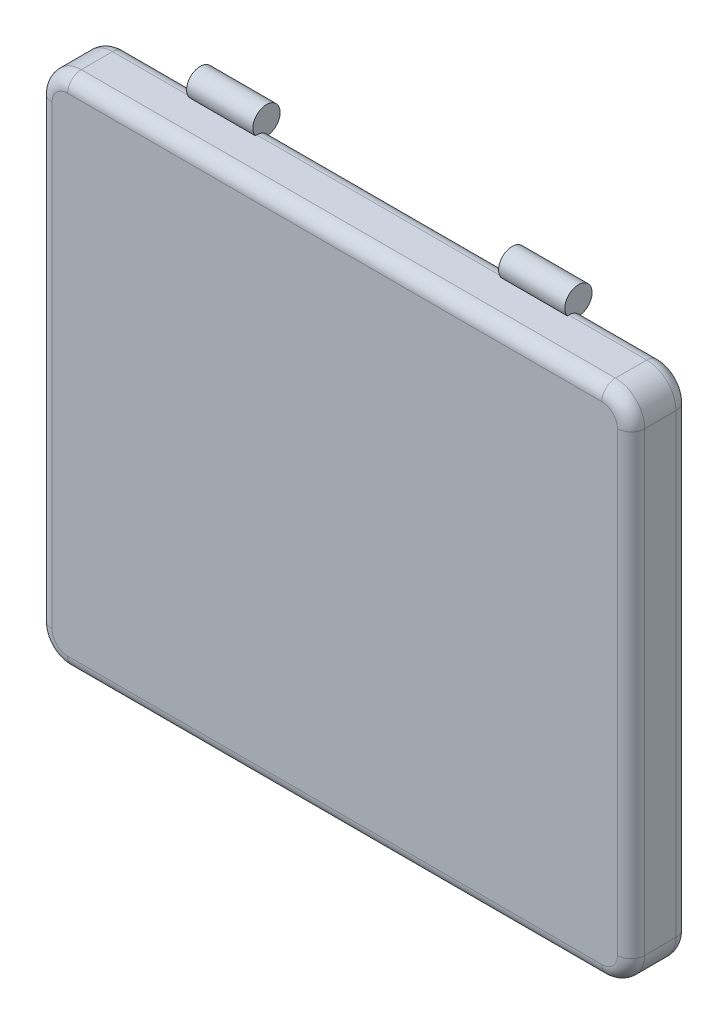
ISO-10303-21;
HEADER;
FILE_DESCRIPTION(('STEP AP214'),'2;1');
FILE_NAME('part.step','',(''),(''),'','','');
FILE_SCHEMA(('AUTOMOTIVE_DESIGN { 1 0 10303 214 1 1 1 1 }'));
ENDSEC;
DATA;
#1=APPLICATION_CONTEXT('core data for automotive mechanical design processes');
#2=APPLICATION_PROTOCOL_DEFINITION('international standard','automotive_design',2000,#1);
#3=PRODUCT_CONTEXT('',#1,'mechanical');
#4=PRODUCT('Part','Part','',(#3));
#5=PRODUCT_RELATED_PRODUCT_CATEGORY('part','',(#4));
#6=PRODUCT_DEFINITION_FORMATION('','',#4);
#7=PRODUCT_DEFINITION_CONTEXT('part definition',#1,'design');
#8=PRODUCT_DEFINITION('design','',#6,#7);
#9=PRODUCT_DEFINITION_SHAPE('','',#8);
#10=(LENGTH_UNIT() NAMED_UNIT(*) SI_UNIT(.MILLI.,.METRE.));
#11=(NAMED_UNIT(*) PLANE_ANGLE_UNIT() SI_UNIT($,.RADIAN.));
#12=(NAMED_UNIT(*) SI_UNIT($,.STERADIAN.) SOLID_ANGLE_UNIT());
#13=UNCERTAINTY_MEASURE_WITH_UNIT(LENGTH_MEASURE(1.E-05),#10,'distance_accuracy_value','');
#14=(GEOMETRIC_REPRESENTATION_CONTEXT(3) GLOBAL_UNCERTAINTY_ASSIGNED_CONTEXT((#13)) GLOBAL_UNIT_ASSIGNED_CONTEXT((#10,
#11,#12)) REPRESENTATION_CONTEXT('',''));
#15=CARTESIAN_POINT('',(0.,0.,0.));
#16=DIRECTION('',(0.,0.,1.));
#17=DIRECTION('',(1.,0.,0.));
#18=AXIS2_PLACEMENT_3D('',#15,#16,#17);
#19=CARTESIAN_POINT('',(358.,-117.,495.));
#20=DIRECTION('',(0.,0.,-1.));
#21=DIRECTION('',(-1.,0.,0.));
#22=AXIS2_PLACEMENT_3D('',#19,#20,#21);
#23=CYLINDRICAL_SURFACE('',#22,15.);
#24=DIRECTION('',(0.,0.,-1.));
#25=VECTOR('',#24,1.);
#26=CARTESIAN_POINT('',(358.,-132.,495.));
#27=LINE('',#26,#25);
#28=CARTESIAN_POINT('',(358.,-132.,488.));
#29=VERTEX_POINT('',#28);
#30=CARTESIAN_POINT('',(358.,-132.,472.));
#31=VERTEX_POINT('',#30);
#32=EDGE_CURVE('E242',#29,#31,#27,.T.);
#33=ORIENTED_EDGE('',*,*,#32,.F.);
#34=CARTESIAN_POINT('',(358.,-117.,488.));
#35=DIRECTION('',(0.,0.,1.));
#36=DIRECTION('',(1.,0.,0.));
#37=AXIS2_PLACEMENT_3D('',#34,#35,#36);
#38=CIRCLE('',#37,15.);
#39=CARTESIAN_POINT('',(343.,-117.,488.));
#40=VERTEX_POINT('',#39);
#41=EDGE_CURVE('E270',#29,#40,#38,.F.);
#42=ORIENTED_EDGE('',*,*,#41,.T.);
#43=DIRECTION('',(0.,0.,-1.));
#44=VECTOR('',#43,1.);
#45=CARTESIAN_POINT('',(343.,-117.,495.));
#46=LINE('',#45,#44);
#47=CARTESIAN_POINT('',(343.,-117.,472.));
#48=VERTEX_POINT('',#47);
#49=EDGE_CURVE('E224',#40,#48,#46,.T.);
#50=ORIENTED_EDGE('',*,*,#49,.T.);
#51=CARTESIAN_POINT('',(358.,-117.,472.));
#52=DIRECTION('',(0.,0.,1.));
#53=DIRECTION('',(1.,0.,0.));
#54=AXIS2_PLACEMENT_3D('',#51,#52,#53);
#55=CIRCLE('',#54,15.);
#56=EDGE_CURVE('E264',#48,#31,#55,.T.);
#57=ORIENTED_EDGE('',*,*,#56,.T.);
#58=EDGE_LOOP('',(#33,#42,#50,#57));
#59=FACE_BOUND('',#58,.T.);
#60=ADVANCED_FACE('F43',(#59),#23,.T.);
#61=CARTESIAN_POINT('',(358.,-132.,495.));
#62=DIRECTION('',(0.,1.,0.));
#63=DIRECTION('',(0.,0.,1.));
#64=AXIS2_PLACEMENT_3D('',#61,#62,#63);
#65=PLANE('',#64);
#66=ORIENTED_EDGE('',*,*,#32,.T.);
#67=DIRECTION('',(1.,0.,0.));
#68=VECTOR('',#67,1.);
#69=CARTESIAN_POINT('',(358.,-132.,472.));
#70=LINE('',#69,#68);
#71=CARTESIAN_POINT('',(632.,-132.,472.));
#72=VERTEX_POINT('',#71);
#73=EDGE_CURVE('E305',#31,#72,#70,.T.);
#74=ORIENTED_EDGE('',*,*,#73,.T.);
#75=DIRECTION('',(0.,0.,-1.));
#76=VECTOR('',#75,1.);
#77=CARTESIAN_POINT('',(632.,-132.,495.));
#78=LINE('',#77,#76);
#79=CARTESIAN_POINT('',(632.,-132.,488.));
#80=VERTEX_POINT('',#79);
#81=EDGE_CURVE('E245',#80,#72,#78,.T.);
#82=ORIENTED_EDGE('',*,*,#81,.F.);
#83=DIRECTION('',(1.,0.,0.));
#84=VECTOR('',#83,1.);
#85=CARTESIAN_POINT('',(358.,-132.,488.));
#86=LINE('',#85,#84);
#87=EDGE_CURVE('E297',#80,#29,#86,.F.);
#88=ORIENTED_EDGE('',*,*,#87,.T.);
#89=EDGE_LOOP('',(#66,#74,#82,#88));
#90=FACE_BOUND('',#89,.T.);
#91=ADVANCED_FACE('F400',(#90),#65,.F.);
#92=CARTESIAN_POINT('',(632.,-117.,495.));
#93=DIRECTION('',(0.,0.,-1.));
#94=DIRECTION('',(-1.,0.,0.));
#95=AXIS2_PLACEMENT_3D('',#92,#93,#94);
#96=CYLINDRICAL_SURFACE('',#95,15.0000000000001);
#97=DIRECTION('',(0.,0.,-1.));
#98=VECTOR('',#97,1.);
#99=CARTESIAN_POINT('',(647.,-117.,495.));
#100=LINE('',#99,#98);
#101=CARTESIAN_POINT('',(647.,-117.,488.));
#102=VERTEX_POINT('',#101);
#103=CARTESIAN_POINT('',(647.,-117.,472.));
#104=VERTEX_POINT('',#103);
#105=EDGE_CURVE('E239',#102,#104,#100,.T.);
#106=ORIENTED_EDGE('',*,*,#105,.F.);
#107=CARTESIAN_POINT('',(632.,-117.,488.));
#108=DIRECTION('',(0.,0.,1.));
#109=DIRECTION('',(1.,0.,0.));
#110=AXIS2_PLACEMENT_3D('',#107,#108,#109);
#111=CIRCLE('',#110,15.0000000000001);
#112=EDGE_CURVE('E283',#102,#80,#111,.F.);
#113=ORIENTED_EDGE('',*,*,#112,.T.);
#114=ORIENTED_EDGE('',*,*,#81,.T.);
#115=CARTESIAN_POINT('',(632.,-117.,472.));
#116=DIRECTION('',(0.,0.,1.));
#117=DIRECTION('',(1.,0.,0.));
#118=AXIS2_PLACEMENT_3D('',#115,#116,#117);
#119=CIRCLE('',#118,15.0000000000001);
#120=EDGE_CURVE('E276',#72,#104,#119,.T.);
#121=ORIENTED_EDGE('',*,*,#120,.T.);
#122=EDGE_LOOP('',(#106,#113,#114,#121));
#123=FACE_BOUND('',#122,.T.);
#124=ADVANCED_FACE('F404',(#123),#96,.T.);
#125=CARTESIAN_POINT('',(647.,-117.,495.));
#126=DIRECTION('',(-1.,0.,0.));
#127=DIRECTION('',(0.,0.,1.));
#128=AXIS2_PLACEMENT_3D('',#125,#126,#127);
#129=PLANE('',#128);
#130=DIRECTION('',(0.,0.,-1.));
#131=VECTOR('',#130,1.);
#132=CARTESIAN_POINT('',(647.,117.,495.));
#133=LINE('',#132,#131);
#134=CARTESIAN_POINT('',(647.,117.,488.));
#135=VERTEX_POINT('',#134);
#136=CARTESIAN_POINT('',(647.,117.,472.));
#137=VERTEX_POINT('',#136);
#138=EDGE_CURVE('E237',#135,#137,#133,.T.);
#139=ORIENTED_EDGE('',*,*,#138,.F.);
#140=DIRECTION('',(0.,1.,0.));
#141=VECTOR('',#140,1.);
#142=CARTESIAN_POINT('',(647.,-117.,488.));
#143=LINE('',#142,#141);
#144=EDGE_CURVE('E309',#135,#102,#143,.F.);
#145=ORIENTED_EDGE('',*,*,#144,.T.);
#146=ORIENTED_EDGE('',*,*,#105,.T.);
#147=DIRECTION('',(0.,1.,0.));
#148=VECTOR('',#147,1.);
#149=CARTESIAN_POINT('',(647.,-117.,472.));
#150=LINE('',#149,#148);
#151=EDGE_CURVE('E306',#104,#137,#150,.T.);
#152=ORIENTED_EDGE('',*,*,#151,.T.);
#153=EDGE_LOOP('',(#139,#145,#146,#152));
#154=FACE_BOUND('',#153,.T.);
#155=ADVANCED_FACE('F489',(#154),#129,.F.);
#156=CARTESIAN_POINT('',(632.,117.,495.));
#157=DIRECTION('',(0.,0.,-1.));
#158=DIRECTION('',(-1.,0.,0.));
#159=AXIS2_PLACEMENT_3D('',#156,#157,#158);
#160=CYLINDRICAL_SURFACE('',#159,15.0000000000001);
#161=DIRECTION('',(0.,0.,-1.));
#162=VECTOR('',#161,1.);
#163=CARTESIAN_POINT('',(632.,132.,495.));
#164=LINE('',#163,#162);
#165=CARTESIAN_POINT('',(632.,132.,488.));
#166=VERTEX_POINT('',#165);
#167=CARTESIAN_POINT('',(632.,132.,472.));
#168=VERTEX_POINT('',#167);
#169=EDGE_CURVE('E232',#166,#168,#164,.T.);
#170=ORIENTED_EDGE('',*,*,#169,.F.);
#171=CARTESIAN_POINT('',(632.,117.,488.));
#172=DIRECTION('',(0.,0.,1.));
#173=DIRECTION('',(1.,0.,0.));
#174=AXIS2_PLACEMENT_3D('',#171,#172,#173);
#175=CIRCLE('',#174,15.0000000000001);
#176=EDGE_CURVE('E280',#166,#135,#175,.F.);
#177=ORIENTED_EDGE('',*,*,#176,.T.);
#178=ORIENTED_EDGE('',*,*,#138,.T.);
#179=CARTESIAN_POINT('',(632.,117.,472.));
#180=DIRECTION('',(0.,0.,1.));
#181=DIRECTION('',(1.,0.,0.));
#182=AXIS2_PLACEMENT_3D('',#179,#180,#181);
#183=CIRCLE('',#182,15.0000000000001);
#184=EDGE_CURVE('E273',#137,#168,#183,.T.);
#185=ORIENTED_EDGE('',*,*,#184,.T.);
#186=EDGE_LOOP('',(#170,#177,#178,#185));
#187=FACE_BOUND('',#186,.T.);
#188=ADVANCED_FACE('F494',(#187),#160,.T.);
#189=CARTESIAN_POINT('',(632.,132.,495.));
#190=DIRECTION('',(0.,-1.,0.));
#191=DIRECTION('',(0.,0.,-1.));
#192=AXIS2_PLACEMENT_3D('',#189,#190,#191);
#193=PLANE('',#192);
#194=DIRECTION('',(-1.,0.,0.));
#195=VECTOR('',#194,1.);
#196=CARTESIAN_POINT('',(632.,132.,472.));
#197=LINE('',#196,#195);
#198=CARTESIAN_POINT('',(592.,132.,472.));
#199=VERTEX_POINT('',#198);
#200=EDGE_CURVE('E311',#168,#199,#197,.T.);
#201=ORIENTED_EDGE('',*,*,#200,.T.);
#202=DIRECTION('',(0.,0.,1.));
#203=VECTOR('',#202,1.);
#204=CARTESIAN_POINT('',(592.,132.,495.));
#205=LINE('',#204,#203);
#206=CARTESIAN_POINT('',(592.,132.,472.744562646538));
#207=VERTEX_POINT('',#206);
#208=EDGE_CURVE('E212',#199,#207,#205,.T.);
#209=ORIENTED_EDGE('',*,*,#208,.T.);
#210=DIRECTION('',(-1.,0.,0.));
#211=VECTOR('',#210,1.);
#212=CARTESIAN_POINT('',(592.,132.,472.744562646538));
#213=LINE('',#212,#211);
#214=CARTESIAN_POINT('',(558.,132.,472.744562646538));
#215=VERTEX_POINT('',#214);
#216=EDGE_CURVE('E219',#215,#207,#213,.F.);
#217=ORIENTED_EDGE('',*,*,#216,.F.);
#218=DIRECTION('',(0.,0.,1.));
#219=VECTOR('',#218,1.);
#220=CARTESIAN_POINT('',(558.,132.,495.));
#221=LINE('',#220,#219);
#222=CARTESIAN_POINT('',(558.,132.,472.));
#223=VERTEX_POINT('',#222);
#224=EDGE_CURVE('E215',#223,#215,#221,.T.);
#225=ORIENTED_EDGE('',*,*,#224,.F.);
#226=CARTESIAN_POINT('',(432.,132.,472.));
#227=VERTEX_POINT('',#226);
#228=EDGE_CURVE('E316',#223,#227,#197,.T.);
#229=ORIENTED_EDGE('',*,*,#228,.T.);
#230=DIRECTION('',(0.,0.,1.));
#231=VECTOR('',#230,1.);
#232=CARTESIAN_POINT('',(432.,132.,495.));
#233=LINE('',#232,#231);
#234=CARTESIAN_POINT('',(432.,132.,472.744562646538));
#235=VERTEX_POINT('',#234);
#236=EDGE_CURVE('E198',#227,#235,#233,.T.);
#237=ORIENTED_EDGE('',*,*,#236,.T.);
#238=DIRECTION('',(-1.,0.,0.));
#239=VECTOR('',#238,1.);
#240=CARTESIAN_POINT('',(432.,132.,472.744562646538));
#241=LINE('',#240,#239);
#242=CARTESIAN_POINT('',(398.,132.,472.744562646538));
#243=VERTEX_POINT('',#242);
#244=EDGE_CURVE('E205',#243,#235,#241,.F.);
#245=ORIENTED_EDGE('',*,*,#244,.F.);
#246=DIRECTION('',(0.,0.,1.));
#247=VECTOR('',#246,1.);
#248=CARTESIAN_POINT('',(398.,132.,495.));
#249=LINE('',#248,#247);
#250=CARTESIAN_POINT('',(398.,132.,472.));
#251=VERTEX_POINT('',#250);
#252=EDGE_CURVE('E189',#251,#243,#249,.T.);
#253=ORIENTED_EDGE('',*,*,#252,.F.);
#254=CARTESIAN_POINT('',(358.,132.,472.));
#255=VERTEX_POINT('',#254);
#256=EDGE_CURVE('E315',#251,#255,#197,.T.);
#257=ORIENTED_EDGE('',*,*,#256,.T.);
#258=DIRECTION('',(0.,0.,-1.));
#259=VECTOR('',#258,1.);
#260=CARTESIAN_POINT('',(358.,132.,495.));
#261=LINE('',#260,#259);
#262=CARTESIAN_POINT('',(358.,132.,488.));
#263=VERTEX_POINT('',#262);
#264=EDGE_CURVE('E227',#263,#255,#261,.T.);
#265=ORIENTED_EDGE('',*,*,#264,.F.);
#266=DIRECTION('',(-1.,0.,0.));
#267=VECTOR('',#266,1.);
#268=CARTESIAN_POINT('',(632.,132.,488.));
#269=LINE('',#268,#267);
#270=EDGE_CURVE('E312',#263,#166,#269,.F.);
#271=ORIENTED_EDGE('',*,*,#270,.T.);
#272=ORIENTED_EDGE('',*,*,#169,.T.);
#273=EDGE_LOOP('',(#201,#209,#217,#225,#229,#237,#245,#253,#257,#265,#271,#272));
#274=FACE_BOUND('',#273,.T.);
#275=ADVANCED_FACE('F209',(#274),#193,.F.);
#276=CARTESIAN_POINT('',(358.,117.,495.));
#277=DIRECTION('',(0.,0.,-1.));
#278=DIRECTION('',(-1.,0.,0.));
#279=AXIS2_PLACEMENT_3D('',#276,#277,#278);
#280=CYLINDRICAL_SURFACE('',#279,15.);
#281=DIRECTION('',(0.,0.,-1.));
#282=VECTOR('',#281,1.);
#283=CARTESIAN_POINT('',(343.,117.,495.));
#284=LINE('',#283,#282);
#285=CARTESIAN_POINT('',(343.,117.,488.));
#286=VERTEX_POINT('',#285);
#287=CARTESIAN_POINT('',(343.,117.,472.));
#288=VERTEX_POINT('',#287);
#289=EDGE_CURVE('E228',#286,#288,#284,.T.);
#290=ORIENTED_EDGE('',*,*,#289,.F.);
#291=CARTESIAN_POINT('',(358.,117.,488.));
#292=DIRECTION('',(0.,0.,1.));
#293=DIRECTION('',(1.,0.,0.));
#294=AXIS2_PLACEMENT_3D('',#291,#292,#293);
#295=CIRCLE('',#294,15.);
#296=EDGE_CURVE('E275',#286,#263,#295,.F.);
#297=ORIENTED_EDGE('',*,*,#296,.T.);
#298=ORIENTED_EDGE('',*,*,#264,.T.);
#299=CARTESIAN_POINT('',(358.,117.,472.));
#300=DIRECTION('',(0.,0.,1.));
#301=DIRECTION('',(1.,0.,0.));
#302=AXIS2_PLACEMENT_3D('',#299,#300,#301);
#303=CIRCLE('',#302,15.);
#304=EDGE_CURVE('E269',#255,#288,#303,.T.);
#305=ORIENTED_EDGE('',*,*,#304,.T.);
#306=EDGE_LOOP('',(#290,#297,#298,#305));
#307=FACE_BOUND('',#306,.T.);
#308=ADVANCED_FACE('F533',(#307),#280,.T.);
#309=CARTESIAN_POINT('',(343.,117.,495.));
#310=DIRECTION('',(1.,0.,0.));
#311=DIRECTION('',(0.,0.,-1.));
#312=AXIS2_PLACEMENT_3D('',#309,#310,#311);
#313=PLANE('',#312);
#314=ORIENTED_EDGE('',*,*,#289,.T.);
#315=DIRECTION('',(0.,-1.,0.));
#316=VECTOR('',#315,1.);
#317=CARTESIAN_POINT('',(343.,117.,472.));
#318=LINE('',#317,#316);
#319=EDGE_CURVE('E308',#288,#48,#318,.T.);
#320=ORIENTED_EDGE('',*,*,#319,.T.);
#321=ORIENTED_EDGE('',*,*,#49,.F.);
#322=DIRECTION('',(0.,-1.,0.));
#323=VECTOR('',#322,1.);
#324=CARTESIAN_POINT('',(343.,117.,488.));
#325=LINE('',#324,#323);
#326=EDGE_CURVE('E303',#40,#286,#325,.F.);
#327=ORIENTED_EDGE('',*,*,#326,.T.);
#328=EDGE_LOOP('',(#314,#320,#321,#327));
#329=FACE_BOUND('',#328,.T.);
#330=ADVANCED_FACE('F522',(#329),#313,.F.);
#331=CARTESIAN_POINT('',(358.,-117.,495.));
#332=DIRECTION('',(0.,0.,1.));
#333=DIRECTION('',(1.,0.,0.));
#334=AXIS2_PLACEMENT_3D('',#331,#332,#333);
#335=PLANE('',#334);
#336=CARTESIAN_POINT('',(632.,117.,495.));
#337=DIRECTION('',(0.,0.,1.));
#338=DIRECTION('',(1.,0.,0.));
#339=AXIS2_PLACEMENT_3D('',#336,#337,#338);
#340=CIRCLE('',#339,8.00000000000014);
#341=CARTESIAN_POINT('',(640.,117.,495.));
#342=VERTEX_POINT('',#341);
#343=CARTESIAN_POINT('',(632.,125.,495.));
#344=VERTEX_POINT('',#343);
#345=EDGE_CURVE('E259',#342,#344,#340,.T.);
#346=ORIENTED_EDGE('',*,*,#345,.T.);
#347=DIRECTION('',(-1.,0.,0.));
#348=VECTOR('',#347,1.);
#349=CARTESIAN_POINT('',(358.,125.,495.));
#350=LINE('',#349,#348);
#351=CARTESIAN_POINT('',(358.,125.,495.));
#352=VERTEX_POINT('',#351);
#353=EDGE_CURVE('E263',#344,#352,#350,.T.);
#354=ORIENTED_EDGE('',*,*,#353,.T.);
#355=CARTESIAN_POINT('',(358.,117.,495.));
#356=DIRECTION('',(0.,0.,1.));
#357=DIRECTION('',(1.,0.,0.));
#358=AXIS2_PLACEMENT_3D('',#355,#356,#357);
#359=CIRCLE('',#358,8.00000000000001);
#360=CARTESIAN_POINT('',(350.,117.,495.));
#361=VERTEX_POINT('',#360);
#362=EDGE_CURVE('E261',#352,#361,#359,.T.);
#363=ORIENTED_EDGE('',*,*,#362,.T.);
#364=DIRECTION('',(0.,-1.,0.));
#365=VECTOR('',#364,1.);
#366=CARTESIAN_POINT('',(350.,-117.,495.));
#367=LINE('',#366,#365);
#368=CARTESIAN_POINT('',(350.,-117.,495.));
#369=VERTEX_POINT('',#368);
#370=EDGE_CURVE('E254',#361,#369,#367,.T.);
#371=ORIENTED_EDGE('',*,*,#370,.T.);
#372=CARTESIAN_POINT('',(358.,-117.,495.));
#373=DIRECTION('',(0.,0.,1.));
#374=DIRECTION('',(1.,0.,0.));
#375=AXIS2_PLACEMENT_3D('',#372,#373,#374);
#376=CIRCLE('',#375,8.00000000000001);
#377=CARTESIAN_POINT('',(358.,-125.,495.));
#378=VERTEX_POINT('',#377);
#379=EDGE_CURVE('E252',#369,#378,#376,.T.);
#380=ORIENTED_EDGE('',*,*,#379,.T.);
#381=DIRECTION('',(1.,0.,0.));
#382=VECTOR('',#381,1.);
#383=CARTESIAN_POINT('',(632.,-125.,495.));
#384=LINE('',#383,#382);
#385=CARTESIAN_POINT('',(632.,-125.,495.));
#386=VERTEX_POINT('',#385);
#387=EDGE_CURVE('E247',#378,#386,#384,.T.);
#388=ORIENTED_EDGE('',*,*,#387,.T.);
#389=CARTESIAN_POINT('',(632.,-117.,495.));
#390=DIRECTION('',(0.,0.,1.));
#391=DIRECTION('',(1.,0.,0.));
#392=AXIS2_PLACEMENT_3D('',#389,#390,#391);
#393=CIRCLE('',#392,8.00000000000014);
#394=CARTESIAN_POINT('',(640.,-117.,495.));
#395=VERTEX_POINT('',#394);
#396=EDGE_CURVE('E249',#386,#395,#393,.T.);
#397=ORIENTED_EDGE('',*,*,#396,.T.);
#398=DIRECTION('',(0.,1.,0.));
#399=VECTOR('',#398,1.);
#400=CARTESIAN_POINT('',(640.,117.,495.));
#401=LINE('',#400,#399);
#402=EDGE_CURVE('E260',#395,#342,#401,.T.);
#403=ORIENTED_EDGE('',*,*,#402,.T.);
#404=EDGE_LOOP('',(#346,#354,#363,#371,#380,#388,#397,#403));
#405=FACE_BOUND('',#404,.T.);
#406=ADVANCED_FACE('F502',(#405),#335,.T.);
#407=CARTESIAN_POINT('',(358.,-117.,465.));
#408=DIRECTION('',(0.,0.,1.));
#409=DIRECTION('',(1.,0.,0.));
#410=AXIS2_PLACEMENT_3D('',#407,#408,#409);
#411=PLANE('',#410);
#412=CARTESIAN_POINT('',(632.,117.,465.));
#413=DIRECTION('',(0.,0.,1.));
#414=DIRECTION('',(1.,0.,0.));
#415=AXIS2_PLACEMENT_3D('',#412,#413,#414);
#416=CIRCLE('',#415,8.00000000000014);
#417=CARTESIAN_POINT('',(632.,125.,465.));
#418=VERTEX_POINT('',#417);
#419=CARTESIAN_POINT('',(640.,117.,465.));
#420=VERTEX_POINT('',#419);
#421=EDGE_CURVE('E293',#418,#420,#416,.F.);
#422=ORIENTED_EDGE('',*,*,#421,.T.);
#423=DIRECTION('',(0.,1.,0.));
#424=VECTOR('',#423,1.);
#425=CARTESIAN_POINT('',(640.,-117.,465.));
#426=LINE('',#425,#424);
#427=CARTESIAN_POINT('',(640.,-117.,465.));
#428=VERTEX_POINT('',#427);
#429=EDGE_CURVE('E296',#420,#428,#426,.F.);
#430=ORIENTED_EDGE('',*,*,#429,.T.);
#431=CARTESIAN_POINT('',(632.,-117.,465.));
#432=DIRECTION('',(0.,0.,1.));
#433=DIRECTION('',(1.,0.,0.));
#434=AXIS2_PLACEMENT_3D('',#431,#432,#433);
#435=CIRCLE('',#434,8.00000000000014);
#436=CARTESIAN_POINT('',(632.,-125.,465.));
#437=VERTEX_POINT('',#436);
#438=EDGE_CURVE('E291',#428,#437,#435,.F.);
#439=ORIENTED_EDGE('',*,*,#438,.T.);
#440=DIRECTION('',(1.,0.,0.));
#441=VECTOR('',#440,1.);
#442=CARTESIAN_POINT('',(358.,-125.,465.));
#443=LINE('',#442,#441);
#444=CARTESIAN_POINT('',(358.,-125.,465.));
#445=VERTEX_POINT('',#444);
#446=EDGE_CURVE('E292',#437,#445,#443,.F.);
#447=ORIENTED_EDGE('',*,*,#446,.T.);
#448=CARTESIAN_POINT('',(358.,-117.,465.));
#449=DIRECTION('',(0.,0.,1.));
#450=DIRECTION('',(1.,0.,0.));
#451=AXIS2_PLACEMENT_3D('',#448,#449,#450);
#452=CIRCLE('',#451,8.00000000000001);
#453=CARTESIAN_POINT('',(350.,-117.,465.));
#454=VERTEX_POINT('',#453);
#455=EDGE_CURVE('E288',#445,#454,#452,.F.);
#456=ORIENTED_EDGE('',*,*,#455,.T.);
#457=DIRECTION('',(0.,-1.,0.));
#458=VECTOR('',#457,1.);
#459=CARTESIAN_POINT('',(350.,-117.,465.));
#460=LINE('',#459,#458);
#461=CARTESIAN_POINT('',(350.,117.,465.));
#462=VERTEX_POINT('',#461);
#463=EDGE_CURVE('E290',#454,#462,#460,.F.);
#464=ORIENTED_EDGE('',*,*,#463,.T.);
#465=CARTESIAN_POINT('',(358.,117.,465.));
#466=DIRECTION('',(0.,0.,1.));
#467=DIRECTION('',(1.,0.,0.));
#468=AXIS2_PLACEMENT_3D('',#465,#466,#467);
#469=CIRCLE('',#468,8.00000000000001);
#470=CARTESIAN_POINT('',(358.,125.,465.));
#471=VERTEX_POINT('',#470);
#472=EDGE_CURVE('E282',#462,#471,#469,.F.);
#473=ORIENTED_EDGE('',*,*,#472,.T.);
#474=DIRECTION('',(-1.,0.,0.));
#475=VECTOR('',#474,1.);
#476=CARTESIAN_POINT('',(358.,125.,465.));
#477=LINE('',#476,#475);
#478=EDGE_CURVE('E281',#471,#418,#477,.F.);
#479=ORIENTED_EDGE('',*,*,#478,.T.);
#480=EDGE_LOOP('',(#422,#430,#439,#447,#456,#464,#473,#479));
#481=FACE_BOUND('',#480,.T.);
#482=ADVANCED_FACE('F442',(#481),#411,.F.);
#483=CARTESIAN_POINT('',(632.,117.,488.));
#484=DIRECTION('',(0.,0.,1.));
#485=DIRECTION('',(1.,0.,0.));
#486=AXIS2_PLACEMENT_3D('',#483,#484,#485);
#487=TOROIDAL_SURFACE('',#486,8.00000000000014,7.);
#488=CARTESIAN_POINT('',(640.,117.,488.));
#489=DIRECTION('',(0.,-1.,0.));
#490=DIRECTION('',(1.,0.,0.));
#491=AXIS2_PLACEMENT_3D('',#488,#489,#490);
#492=CIRCLE('',#491,7.);
#493=EDGE_CURVE('E333',#135,#342,#492,.T.);
#494=ORIENTED_EDGE('',*,*,#493,.F.);
#495=ORIENTED_EDGE('',*,*,#176,.F.);
#496=CARTESIAN_POINT('',(632.,125.,488.));
#497=DIRECTION('',(-1.,0.,0.));
#498=DIRECTION('',(0.,0.,1.));
#499=AXIS2_PLACEMENT_3D('',#496,#497,#498);
#500=CIRCLE('',#499,7.);
#501=EDGE_CURVE('E230',#344,#166,#500,.T.);
#502=ORIENTED_EDGE('',*,*,#501,.F.);
#503=ORIENTED_EDGE('',*,*,#345,.F.);
#504=EDGE_LOOP('',(#494,#495,#502,#503));
#505=FACE_BOUND('',#504,.T.);
#506=ADVANCED_FACE('F440',(#505),#487,.T.);
#507=CARTESIAN_POINT('',(358.,125.,488.));
#508=DIRECTION('',(1.,0.,0.));
#509=DIRECTION('',(0.,0.,-1.));
#510=AXIS2_PLACEMENT_3D('',#507,#508,#509);
#511=CYLINDRICAL_SURFACE('',#510,7.);
#512=ORIENTED_EDGE('',*,*,#501,.T.);
#513=ORIENTED_EDGE('',*,*,#270,.F.);
#514=CARTESIAN_POINT('',(358.,125.,488.));
#515=DIRECTION('',(-1.,0.,0.));
#516=DIRECTION('',(0.,0.,1.));
#517=AXIS2_PLACEMENT_3D('',#514,#515,#516);
#518=CIRCLE('',#517,7.);
#519=EDGE_CURVE('E335',#352,#263,#518,.T.);
#520=ORIENTED_EDGE('',*,*,#519,.F.);
#521=ORIENTED_EDGE('',*,*,#353,.F.);
#522=EDGE_LOOP('',(#512,#513,#520,#521));
#523=FACE_BOUND('',#522,.T.);
#524=ADVANCED_FACE('F433',(#523),#511,.T.);
#525=CARTESIAN_POINT('',(640.,-117.,488.));
#526=DIRECTION('',(0.,-1.,0.));
#527=DIRECTION('',(0.,0.,-1.));
#528=AXIS2_PLACEMENT_3D('',#525,#526,#527);
#529=CYLINDRICAL_SURFACE('',#528,7.);
#530=ORIENTED_EDGE('',*,*,#493,.T.);
#531=ORIENTED_EDGE('',*,*,#402,.F.);
#532=CARTESIAN_POINT('',(640.,-117.,488.));
#533=DIRECTION('',(0.,-1.,0.));
#534=DIRECTION('',(0.,0.,-1.));
#535=AXIS2_PLACEMENT_3D('',#532,#533,#534);
#536=CIRCLE('',#535,7.);
#537=EDGE_CURVE('E328',#102,#395,#536,.T.);
#538=ORIENTED_EDGE('',*,*,#537,.F.);
#539=ORIENTED_EDGE('',*,*,#144,.F.);
#540=EDGE_LOOP('',(#530,#531,#538,#539));
#541=FACE_BOUND('',#540,.T.);
#542=ADVANCED_FACE('F427',(#541),#529,.T.);
#543=CARTESIAN_POINT('',(358.,117.,488.));
#544=DIRECTION('',(0.,0.,1.));
#545=DIRECTION('',(1.,0.,0.));
#546=AXIS2_PLACEMENT_3D('',#543,#544,#545);
#547=TOROIDAL_SURFACE('',#546,8.00000000000001,7.);
#548=ORIENTED_EDGE('',*,*,#519,.T.);
#549=ORIENTED_EDGE('',*,*,#296,.F.);
#550=CARTESIAN_POINT('',(350.,117.,488.));
#551=DIRECTION('',(0.,-1.,0.));
#552=DIRECTION('',(0.,0.,-1.));
#553=AXIS2_PLACEMENT_3D('',#550,#551,#552);
#554=CIRCLE('',#553,7.);
#555=EDGE_CURVE('E326',#361,#286,#554,.T.);
#556=ORIENTED_EDGE('',*,*,#555,.F.);
#557=ORIENTED_EDGE('',*,*,#362,.F.);
#558=EDGE_LOOP('',(#548,#549,#556,#557));
#559=FACE_BOUND('',#558,.T.);
#560=ADVANCED_FACE('F422',(#559),#547,.T.);
#561=CARTESIAN_POINT('',(632.,-117.,488.));
#562=DIRECTION('',(0.,0.,1.));
#563=DIRECTION('',(1.,0.,0.));
#564=AXIS2_PLACEMENT_3D('',#561,#562,#563);
#565=TOROIDAL_SURFACE('',#564,8.00000000000014,7.);
#566=ORIENTED_EDGE('',*,*,#537,.T.);
#567=ORIENTED_EDGE('',*,*,#396,.F.);
#568=CARTESIAN_POINT('',(632.,-125.,488.));
#569=DIRECTION('',(-1.,0.,0.));
#570=DIRECTION('',(0.,0.,1.));
#571=AXIS2_PLACEMENT_3D('',#568,#569,#570);
#572=CIRCLE('',#571,7.);
#573=EDGE_CURVE('E323',#80,#386,#572,.T.);
#574=ORIENTED_EDGE('',*,*,#573,.F.);
#575=ORIENTED_EDGE('',*,*,#112,.F.);
#576=EDGE_LOOP('',(#566,#567,#574,#575));
#577=FACE_BOUND('',#576,.T.);
#578=ADVANCED_FACE('F423',(#577),#565,.T.);
#579=CARTESIAN_POINT('',(350.,-117.,488.));
#580=DIRECTION('',(0.,1.,0.));
#581=DIRECTION('',(0.,0.,1.));
#582=AXIS2_PLACEMENT_3D('',#579,#580,#581);
#583=CYLINDRICAL_SURFACE('',#582,7.);
#584=ORIENTED_EDGE('',*,*,#555,.T.);
#585=ORIENTED_EDGE('',*,*,#326,.F.);
#586=CARTESIAN_POINT('',(350.,-117.,488.));
#587=DIRECTION('',(0.,-1.,0.));
#588=DIRECTION('',(0.,0.,-1.));
#589=AXIS2_PLACEMENT_3D('',#586,#587,#588);
#590=CIRCLE('',#589,7.);
#591=EDGE_CURVE('E319',#369,#40,#590,.T.);
#592=ORIENTED_EDGE('',*,*,#591,.F.);
#593=ORIENTED_EDGE('',*,*,#370,.F.);
#594=EDGE_LOOP('',(#584,#585,#592,#593));
#595=FACE_BOUND('',#594,.T.);
#596=ADVANCED_FACE('F417',(#595),#583,.T.);
#597=CARTESIAN_POINT('',(358.,-125.,488.));
#598=DIRECTION('',(-1.,0.,0.));
#599=DIRECTION('',(0.,0.,1.));
#600=AXIS2_PLACEMENT_3D('',#597,#598,#599);
#601=CYLINDRICAL_SURFACE('',#600,7.);
#602=ORIENTED_EDGE('',*,*,#573,.T.);
#603=ORIENTED_EDGE('',*,*,#387,.F.);
#604=CARTESIAN_POINT('',(358.,-125.,488.));
#605=DIRECTION('',(-1.,0.,0.));
#606=DIRECTION('',(0.,0.,1.));
#607=AXIS2_PLACEMENT_3D('',#604,#605,#606);
#608=CIRCLE('',#607,7.);
#609=EDGE_CURVE('E318',#29,#378,#608,.T.);
#610=ORIENTED_EDGE('',*,*,#609,.F.);
#611=ORIENTED_EDGE('',*,*,#87,.F.);
#612=EDGE_LOOP('',(#602,#603,#610,#611));
#613=FACE_BOUND('',#612,.T.);
#614=ADVANCED_FACE('F412',(#613),#601,.T.);
#615=CARTESIAN_POINT('',(358.,-117.,488.));
#616=DIRECTION('',(0.,0.,1.));
#617=DIRECTION('',(1.,0.,0.));
#618=AXIS2_PLACEMENT_3D('',#615,#616,#617);
#619=TOROIDAL_SURFACE('',#618,8.00000000000001,7.);
#620=ORIENTED_EDGE('',*,*,#591,.T.);
#621=ORIENTED_EDGE('',*,*,#41,.F.);
#622=ORIENTED_EDGE('',*,*,#609,.T.);
#623=ORIENTED_EDGE('',*,*,#379,.F.);
#624=EDGE_LOOP('',(#620,#621,#622,#623));
#625=FACE_BOUND('',#624,.T.);
#626=ADVANCED_FACE('F407',(#625),#619,.T.);
#627=CARTESIAN_POINT('',(358.,-117.,472.));
#628=DIRECTION('',(0.,0.,1.));
#629=DIRECTION('',(1.,0.,0.));
#630=AXIS2_PLACEMENT_3D('',#627,#628,#629);
#631=TOROIDAL_SURFACE('',#630,8.00000000000001,7.);
#632=CARTESIAN_POINT('',(350.,-117.,472.));
#633=DIRECTION('',(0.,1.,0.));
#634=DIRECTION('',(0.,0.,1.));
#635=AXIS2_PLACEMENT_3D('',#632,#633,#634);
#636=CIRCLE('',#635,7.);
#637=EDGE_CURVE('E352',#454,#48,#636,.T.);
#638=ORIENTED_EDGE('',*,*,#637,.F.);
#639=ORIENTED_EDGE('',*,*,#455,.F.);
#640=CARTESIAN_POINT('',(358.,-125.,472.));
#641=DIRECTION('',(1.,0.,0.));
#642=DIRECTION('',(0.,0.,-1.));
#643=AXIS2_PLACEMENT_3D('',#640,#641,#642);
#644=CIRCLE('',#643,7.);
#645=EDGE_CURVE('E321',#31,#445,#644,.T.);
#646=ORIENTED_EDGE('',*,*,#645,.F.);
#647=ORIENTED_EDGE('',*,*,#56,.F.);
#648=EDGE_LOOP('',(#638,#639,#646,#647));
#649=FACE_BOUND('',#648,.T.);
#650=ADVANCED_FACE('F44',(#649),#631,.T.);
#651=CARTESIAN_POINT('',(358.,-125.,472.));
#652=DIRECTION('',(1.,0.,0.));
#653=DIRECTION('',(0.,0.,-1.));
#654=AXIS2_PLACEMENT_3D('',#651,#652,#653);
#655=CYLINDRICAL_SURFACE('',#654,7.);
#656=ORIENTED_EDGE('',*,*,#645,.T.);
#657=ORIENTED_EDGE('',*,*,#446,.F.);
#658=CARTESIAN_POINT('',(632.,-125.,472.));
#659=DIRECTION('',(1.,0.,0.));
#660=DIRECTION('',(0.,0.,-1.));
#661=AXIS2_PLACEMENT_3D('',#658,#659,#660);
#662=CIRCLE('',#661,7.);
#663=EDGE_CURVE('E355',#72,#437,#662,.T.);
#664=ORIENTED_EDGE('',*,*,#663,.F.);
#665=ORIENTED_EDGE('',*,*,#73,.F.);
#666=EDGE_LOOP('',(#656,#657,#664,#665));
#667=FACE_BOUND('',#666,.T.);
#668=ADVANCED_FACE('F461',(#667),#655,.T.);
#669=CARTESIAN_POINT('',(350.,117.,472.));
#670=DIRECTION('',(0.,-1.,0.));
#671=DIRECTION('',(0.,0.,-1.));
#672=AXIS2_PLACEMENT_3D('',#669,#670,#671);
#673=CYLINDRICAL_SURFACE('',#672,7.);
#674=ORIENTED_EDGE('',*,*,#637,.T.);
#675=ORIENTED_EDGE('',*,*,#319,.F.);
#676=CARTESIAN_POINT('',(350.,117.,472.));
#677=DIRECTION('',(0.,1.,0.));
#678=DIRECTION('',(0.,0.,1.));
#679=AXIS2_PLACEMENT_3D('',#676,#677,#678);
#680=CIRCLE('',#679,7.);
#681=EDGE_CURVE('E349',#462,#288,#680,.T.);
#682=ORIENTED_EDGE('',*,*,#681,.F.);
#683=ORIENTED_EDGE('',*,*,#463,.F.);
#684=EDGE_LOOP('',(#674,#675,#682,#683));
#685=FACE_BOUND('',#684,.T.);
#686=ADVANCED_FACE('F458',(#685),#673,.T.);
#687=CARTESIAN_POINT('',(632.,-117.,472.));
#688=DIRECTION('',(0.,0.,1.));
#689=DIRECTION('',(1.,0.,0.));
#690=AXIS2_PLACEMENT_3D('',#687,#688,#689);
#691=TOROIDAL_SURFACE('',#690,8.00000000000014,7.);
#692=ORIENTED_EDGE('',*,*,#663,.T.);
#693=ORIENTED_EDGE('',*,*,#438,.F.);
#694=CARTESIAN_POINT('',(640.,-117.,472.));
#695=DIRECTION('',(0.,1.,0.));
#696=DIRECTION('',(0.,0.,1.));
#697=AXIS2_PLACEMENT_3D('',#694,#695,#696);
#698=CIRCLE('',#697,7.);
#699=EDGE_CURVE('E347',#104,#428,#698,.T.);
#700=ORIENTED_EDGE('',*,*,#699,.F.);
#701=ORIENTED_EDGE('',*,*,#120,.F.);
#702=EDGE_LOOP('',(#692,#693,#700,#701));
#703=FACE_BOUND('',#702,.T.);
#704=ADVANCED_FACE('F457',(#703),#691,.T.);
#705=CARTESIAN_POINT('',(358.,117.,472.));
#706=DIRECTION('',(0.,0.,1.));
#707=DIRECTION('',(1.,0.,0.));
#708=AXIS2_PLACEMENT_3D('',#705,#706,#707);
#709=TOROIDAL_SURFACE('',#708,8.00000000000001,7.);
#710=ORIENTED_EDGE('',*,*,#681,.T.);
#711=ORIENTED_EDGE('',*,*,#304,.F.);
#712=CARTESIAN_POINT('',(358.,125.,472.));
#713=DIRECTION('',(1.,0.,0.));
#714=DIRECTION('',(0.,0.,-1.));
#715=AXIS2_PLACEMENT_3D('',#712,#713,#714);
#716=CIRCLE('',#715,7.);
#717=EDGE_CURVE('E342',#471,#255,#716,.T.);
#718=ORIENTED_EDGE('',*,*,#717,.F.);
#719=ORIENTED_EDGE('',*,*,#472,.F.);
#720=EDGE_LOOP('',(#710,#711,#718,#719));
#721=FACE_BOUND('',#720,.T.);
#722=ADVANCED_FACE('F455',(#721),#709,.T.);
#723=CARTESIAN_POINT('',(640.,-117.,472.));
#724=DIRECTION('',(0.,1.,0.));
#725=DIRECTION('',(0.,0.,1.));
#726=AXIS2_PLACEMENT_3D('',#723,#724,#725);
#727=CYLINDRICAL_SURFACE('',#726,7.);
#728=ORIENTED_EDGE('',*,*,#699,.T.);
#729=ORIENTED_EDGE('',*,*,#429,.F.);
#730=CARTESIAN_POINT('',(640.,117.,472.));
#731=DIRECTION('',(0.,1.,0.));
#732=DIRECTION('',(0.,0.,1.));
#733=AXIS2_PLACEMENT_3D('',#730,#731,#732);
#734=CIRCLE('',#733,7.);
#735=EDGE_CURVE('E341',#137,#420,#734,.T.);
#736=ORIENTED_EDGE('',*,*,#735,.F.);
#737=ORIENTED_EDGE('',*,*,#151,.F.);
#738=EDGE_LOOP('',(#728,#729,#736,#737));
#739=FACE_BOUND('',#738,.T.);
#740=ADVANCED_FACE('F449',(#739),#727,.T.);
#741=CARTESIAN_POINT('',(632.,125.,472.));
#742=DIRECTION('',(-1.,0.,0.));
#743=DIRECTION('',(0.,0.,1.));
#744=AXIS2_PLACEMENT_3D('',#741,#742,#743);
#745=CYLINDRICAL_SURFACE('',#744,7.);
#746=CARTESIAN_POINT('',(592.,125.,472.));
#747=DIRECTION('',(1.,0.,0.));
#748=DIRECTION('',(0.,0.,-1.));
#749=AXIS2_PLACEMENT_3D('',#746,#747,#748);
#750=CIRCLE('',#749,7.);
#751=CARTESIAN_POINT('',(592.,129.036985660048,466.281368452106));
#752=VERTEX_POINT('',#751);
#753=EDGE_CURVE('E11',#199,#752,#750,.F.);
#754=ORIENTED_EDGE('',*,*,#753,.F.);
#755=ORIENTED_EDGE('',*,*,#200,.F.);
#756=CARTESIAN_POINT('',(632.,125.,472.));
#757=DIRECTION('',(1.,0.,0.));
#758=DIRECTION('',(0.,0.,-1.));
#759=AXIS2_PLACEMENT_3D('',#756,#757,#758);
#760=CIRCLE('',#759,7.);
#761=EDGE_CURVE('E225',#418,#168,#760,.T.);
#762=ORIENTED_EDGE('',*,*,#761,.F.);
#763=ORIENTED_EDGE('',*,*,#478,.F.);
#764=ORIENTED_EDGE('',*,*,#717,.T.);
#765=ORIENTED_EDGE('',*,*,#256,.F.);
#766=CARTESIAN_POINT('',(398.,125.,472.));
#767=DIRECTION('',(1.,0.,0.));
#768=DIRECTION('',(0.,0.,-1.));
#769=AXIS2_PLACEMENT_3D('',#766,#767,#768);
#770=CIRCLE('',#769,7.);
#771=CARTESIAN_POINT('',(398.,129.036985660048,466.281368452106));
#772=VERTEX_POINT('',#771);
#773=EDGE_CURVE('E195',#251,#772,#770,.F.);
#774=ORIENTED_EDGE('',*,*,#773,.T.);
#775=DIRECTION('',(-1.,0.,0.));
#776=VECTOR('',#775,1.);
#777=CARTESIAN_POINT('',(415.,129.036985660048,466.281368452106));
#778=LINE('',#777,#776);
#779=CARTESIAN_POINT('',(432.,129.036985660048,466.281368452106));
#780=VERTEX_POINT('',#779);
#781=EDGE_CURVE('E202',#772,#780,#778,.F.);
#782=ORIENTED_EDGE('',*,*,#781,.T.);
#783=CARTESIAN_POINT('',(432.,125.,472.));
#784=DIRECTION('',(1.,0.,0.));
#785=DIRECTION('',(0.,0.,-1.));
#786=AXIS2_PLACEMENT_3D('',#783,#784,#785);
#787=CIRCLE('',#786,7.);
#788=EDGE_CURVE('E362',#227,#780,#787,.F.);
#789=ORIENTED_EDGE('',*,*,#788,.F.);
#790=ORIENTED_EDGE('',*,*,#228,.F.);
#791=CARTESIAN_POINT('',(558.,125.,472.));
#792=DIRECTION('',(1.,0.,0.));
#793=DIRECTION('',(0.,0.,-1.));
#794=AXIS2_PLACEMENT_3D('',#791,#792,#793);
#795=CIRCLE('',#794,7.);
#796=CARTESIAN_POINT('',(558.,129.036985660048,466.281368452106));
#797=VERTEX_POINT('',#796);
#798=EDGE_CURVE('E365',#223,#797,#795,.F.);
#799=ORIENTED_EDGE('',*,*,#798,.T.);
#800=DIRECTION('',(-1.,0.,0.));
#801=VECTOR('',#800,1.);
#802=CARTESIAN_POINT('',(575.,129.036985660048,466.281368452106));
#803=LINE('',#802,#801);
#804=EDGE_CURVE('E51',#797,#752,#803,.F.);
#805=ORIENTED_EDGE('',*,*,#804,.T.);
#806=EDGE_LOOP('',(#754,#755,#762,#763,#764,#765,#774,#782,#789,#790,#799,#805));
#807=FACE_BOUND('',#806,.T.);
#808=ADVANCED_FACE('F369',(#807),#745,.T.);
#809=CARTESIAN_POINT('',(632.,117.,472.));
#810=DIRECTION('',(0.,0.,1.));
#811=DIRECTION('',(1.,0.,0.));
#812=AXIS2_PLACEMENT_3D('',#809,#810,#811);
#813=TOROIDAL_SURFACE('',#812,8.00000000000014,7.);
#814=ORIENTED_EDGE('',*,*,#735,.T.);
#815=ORIENTED_EDGE('',*,*,#421,.F.);
#816=ORIENTED_EDGE('',*,*,#761,.T.);
#817=ORIENTED_EDGE('',*,*,#184,.F.);
#818=EDGE_LOOP('',(#814,#815,#816,#817));
#819=FACE_BOUND('',#818,.T.);
#820=ADVANCED_FACE('F444',(#819),#813,.T.);
#821=CARTESIAN_POINT('',(432.,136.,467.));
#822=DIRECTION('',(-1.,0.,0.));
#823=DIRECTION('',(0.,0.,1.));
#824=AXIS2_PLACEMENT_3D('',#821,#822,#823);
#825=CYLINDRICAL_SURFACE('',#824,7.);
#826=CARTESIAN_POINT('',(398.,136.,467.));
#827=DIRECTION('',(1.,0.,0.));
#828=DIRECTION('',(0.,0.,-1.));
#829=AXIS2_PLACEMENT_3D('',#826,#827,#828);
#830=CIRCLE('',#829,7.);
#831=EDGE_CURVE('E66',#772,#243,#830,.T.);
#832=ORIENTED_EDGE('',*,*,#831,.T.);
#833=ORIENTED_EDGE('',*,*,#244,.T.);
#834=CARTESIAN_POINT('',(432.,136.,467.));
#835=DIRECTION('',(1.,0.,0.));
#836=DIRECTION('',(0.,0.,-1.));
#837=AXIS2_PLACEMENT_3D('',#834,#835,#836);
#838=CIRCLE('',#837,7.);
#839=EDGE_CURVE('E206',#780,#235,#838,.T.);
#840=ORIENTED_EDGE('',*,*,#839,.F.);
#841=ORIENTED_EDGE('',*,*,#781,.F.);
#842=EDGE_LOOP('',(#832,#833,#840,#841));
#843=FACE_BOUND('',#842,.T.);
#844=ADVANCED_FACE('F199',(#843),#825,.T.);
#845=CARTESIAN_POINT('',(432.,136.,467.));
#846=DIRECTION('',(1.,0.,0.));
#847=DIRECTION('',(0.,0.,-1.));
#848=AXIS2_PLACEMENT_3D('',#845,#846,#847);
#849=PLANE('',#848);
#850=ORIENTED_EDGE('',*,*,#236,.F.);
#851=ORIENTED_EDGE('',*,*,#788,.T.);
#852=ORIENTED_EDGE('',*,*,#839,.T.);
#853=EDGE_LOOP('',(#850,#851,#852));
#854=FACE_BOUND('',#853,.T.);
#855=ADVANCED_FACE('F385',(#854),#849,.T.);
#856=CARTESIAN_POINT('',(398.,136.,467.));
#857=DIRECTION('',(1.,0.,0.));
#858=DIRECTION('',(0.,0.,-1.));
#859=AXIS2_PLACEMENT_3D('',#856,#857,#858);
#860=PLANE('',#859);
#861=ORIENTED_EDGE('',*,*,#773,.F.);
#862=ORIENTED_EDGE('',*,*,#252,.T.);
#863=ORIENTED_EDGE('',*,*,#831,.F.);
#864=EDGE_LOOP('',(#861,#862,#863));
#865=FACE_BOUND('',#864,.T.);
#866=ADVANCED_FACE('F187',(#865),#860,.F.);
#867=CARTESIAN_POINT('',(592.,136.,467.));
#868=DIRECTION('',(-1.,0.,0.));
#869=DIRECTION('',(0.,0.,1.));
#870=AXIS2_PLACEMENT_3D('',#867,#868,#869);
#871=CYLINDRICAL_SURFACE('',#870,7.);
#872=CARTESIAN_POINT('',(558.,136.,467.));
#873=DIRECTION('',(1.,0.,0.));
#874=DIRECTION('',(0.,0.,-1.));
#875=AXIS2_PLACEMENT_3D('',#872,#873,#874);
#876=CIRCLE('',#875,7.);
#877=EDGE_CURVE('E59',#797,#215,#876,.T.);
#878=ORIENTED_EDGE('',*,*,#877,.T.);
#879=ORIENTED_EDGE('',*,*,#216,.T.);
#880=CARTESIAN_POINT('',(592.,136.,467.));
#881=DIRECTION('',(1.,0.,0.));
#882=DIRECTION('',(0.,0.,-1.));
#883=AXIS2_PLACEMENT_3D('',#880,#881,#882);
#884=CIRCLE('',#883,7.);
#885=EDGE_CURVE('E197',#752,#207,#884,.T.);
#886=ORIENTED_EDGE('',*,*,#885,.F.);
#887=ORIENTED_EDGE('',*,*,#804,.F.);
#888=EDGE_LOOP('',(#878,#879,#886,#887));
#889=FACE_BOUND('',#888,.T.);
#890=ADVANCED_FACE('F372',(#889),#871,.T.);
#891=CARTESIAN_POINT('',(592.,136.,467.));
#892=DIRECTION('',(1.,0.,0.));
#893=DIRECTION('',(0.,0.,-1.));
#894=AXIS2_PLACEMENT_3D('',#891,#892,#893);
#895=PLANE('',#894);
#896=ORIENTED_EDGE('',*,*,#208,.F.);
#897=ORIENTED_EDGE('',*,*,#753,.T.);
#898=ORIENTED_EDGE('',*,*,#885,.T.);
#899=EDGE_LOOP('',(#896,#897,#898));
#900=FACE_BOUND('',#899,.T.);
#901=ADVANCED_FACE('F388',(#900),#895,.T.);
#902=CARTESIAN_POINT('',(558.,136.,467.));
#903=DIRECTION('',(1.,0.,0.));
#904=DIRECTION('',(0.,0.,-1.));
#905=AXIS2_PLACEMENT_3D('',#902,#903,#904);
#906=PLANE('',#905);
#907=ORIENTED_EDGE('',*,*,#798,.F.);
#908=ORIENTED_EDGE('',*,*,#224,.T.);
#909=ORIENTED_EDGE('',*,*,#877,.F.);
#910=EDGE_LOOP('',(#907,#908,#909));
#911=FACE_BOUND('',#910,.T.);
#912=ADVANCED_FACE('F389',(#911),#906,.F.);
#913=CLOSED_SHELL('',(#60,#91,#124,#155,#188,#275,#308,#330,#406,#482,#506,#524,#542,#560,#578,
#596,#614,#626,#650,#668,#686,#704,#722,#740,#808,#820,#844,#855,#866,#890,#901,#912));
#914=MANIFOLD_SOLID_BREP('B2',#913);
#915=ADVANCED_BREP_SHAPE_REPRESENTATION('',(#18,#914),#14);
#916=SHAPE_DEFINITION_REPRESENTATION(#9,#915);
ENDSEC;
END-ISO-10303-21;
